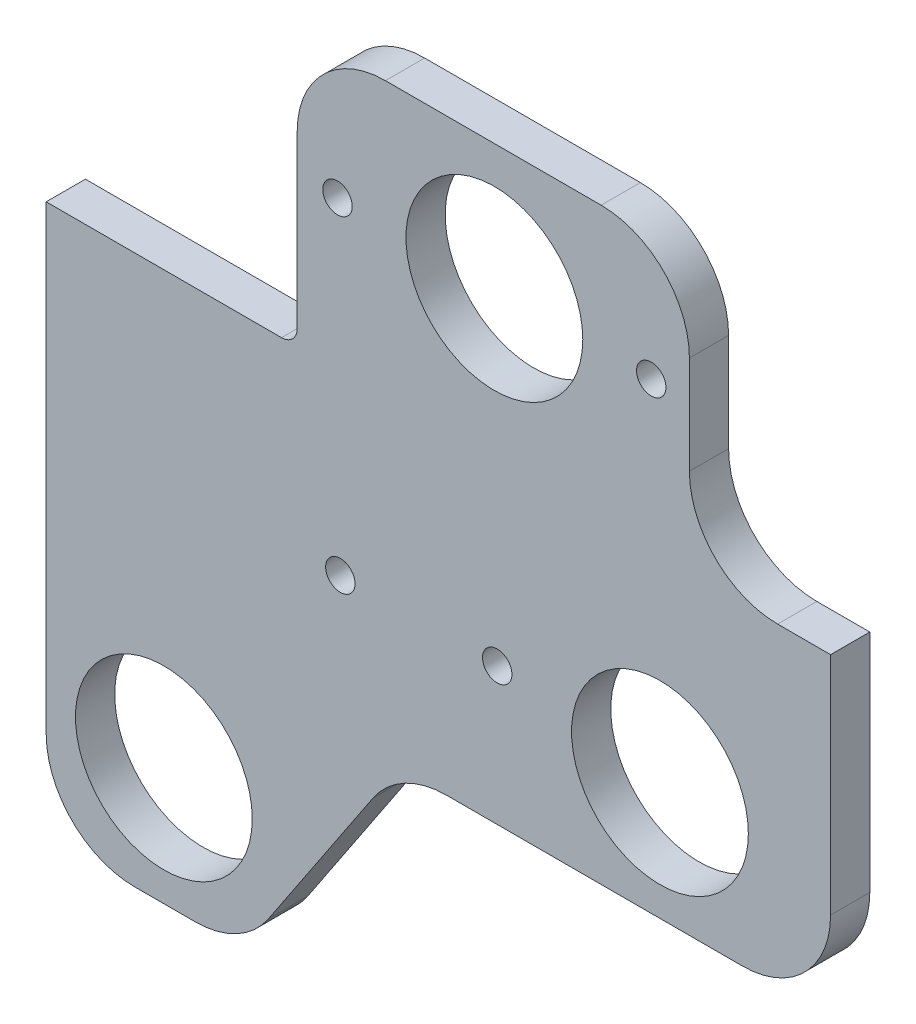
ISO-10303-21;
HEADER;
FILE_DESCRIPTION(('STEP AP214'),'2;1');
FILE_NAME('part.step','',(''),(''),'','','');
FILE_SCHEMA(('AUTOMOTIVE_DESIGN { 1 0 10303 214 1 1 1 1 }'));
ENDSEC;
DATA;
#1=APPLICATION_CONTEXT('core data for automotive mechanical design processes');
#2=APPLICATION_PROTOCOL_DEFINITION('international standard','automotive_design',2000,#1);
#3=PRODUCT_CONTEXT('',#1,'mechanical');
#4=PRODUCT('Part','Part','',(#3));
#5=PRODUCT_RELATED_PRODUCT_CATEGORY('part','',(#4));
#6=PRODUCT_DEFINITION_FORMATION('','',#4);
#7=PRODUCT_DEFINITION_CONTEXT('part definition',#1,'design');
#8=PRODUCT_DEFINITION('design','',#6,#7);
#9=PRODUCT_DEFINITION_SHAPE('','',#8);
#10=(LENGTH_UNIT() NAMED_UNIT(*) SI_UNIT(.MILLI.,.METRE.));
#11=(NAMED_UNIT(*) PLANE_ANGLE_UNIT() SI_UNIT($,.RADIAN.));
#12=(NAMED_UNIT(*) SI_UNIT($,.STERADIAN.) SOLID_ANGLE_UNIT());
#13=UNCERTAINTY_MEASURE_WITH_UNIT(LENGTH_MEASURE(1.E-05),#10,'distance_accuracy_value','');
#14=(GEOMETRIC_REPRESENTATION_CONTEXT(3) GLOBAL_UNCERTAINTY_ASSIGNED_CONTEXT((#13)) GLOBAL_UNIT_ASSIGNED_CONTEXT((#10,
#11,#12)) REPRESENTATION_CONTEXT('',''));
#15=CARTESIAN_POINT('',(0.,0.,0.));
#16=DIRECTION('',(0.,0.,1.));
#17=DIRECTION('',(1.,0.,0.));
#18=AXIS2_PLACEMENT_3D('',#15,#16,#17);
#19=CARTESIAN_POINT('',(0.,44.45,6.35));
#20=DIRECTION('',(0.,1.,0.));
#21=DIRECTION('',(0.,0.,1.));
#22=AXIS2_PLACEMENT_3D('',#19,#20,#21);
#23=PLANE('',#22);
#24=DIRECTION('',(1.,0.,0.));
#25=VECTOR('',#24,1.);
#26=CARTESIAN_POINT('',(0.,44.45,0.));
#27=LINE('',#26,#25);
#28=CARTESIAN_POINT('',(54.9275,44.45,0.));
#29=VERTEX_POINT('',#28);
#30=CARTESIAN_POINT('',(63.5,44.45,0.));
#31=VERTEX_POINT('',#30);
#32=EDGE_CURVE('E218',#29,#31,#27,.T.);
#33=ORIENTED_EDGE('',*,*,#32,.F.);
#34=DIRECTION('',(0.,0.,1.));
#35=VECTOR('',#34,1.);
#36=CARTESIAN_POINT('',(54.9275,44.45,6.35));
#37=LINE('',#36,#35);
#38=CARTESIAN_POINT('',(54.9275,44.45,6.35));
#39=VERTEX_POINT('',#38);
#40=EDGE_CURVE('E171',#29,#39,#37,.T.);
#41=ORIENTED_EDGE('',*,*,#40,.T.);
#42=DIRECTION('',(1.,0.,0.));
#43=VECTOR('',#42,1.);
#44=CARTESIAN_POINT('',(0.,44.45,6.35));
#45=LINE('',#44,#43);
#46=CARTESIAN_POINT('',(63.5,44.45,6.35));
#47=VERTEX_POINT('',#46);
#48=EDGE_CURVE('E165',#39,#47,#45,.T.);
#49=ORIENTED_EDGE('',*,*,#48,.T.);
#50=DIRECTION('',(0.,0.,-1.));
#51=VECTOR('',#50,1.);
#52=CARTESIAN_POINT('',(63.5,44.45,6.35));
#53=LINE('',#52,#51);
#54=EDGE_CURVE('E168',#47,#31,#53,.T.);
#55=ORIENTED_EDGE('',*,*,#54,.T.);
#56=EDGE_LOOP('',(#33,#41,#49,#55));
#57=FACE_BOUND('',#56,.T.);
#58=ADVANCED_FACE('F39',(#57),#23,.T.);
#59=CARTESIAN_POINT('',(-1.46538461538461,0.976923076923073,6.35));
#60=DIRECTION('',(0.832050294337844,-0.554700196225228,0.));
#61=DIRECTION('',(0.554700196225228,0.832050294337844,0.));
#62=AXIS2_PLACEMENT_3D('',#59,#60,#61);
#63=PLANE('',#62);
#64=DIRECTION('',(-0.554700196225228,-0.832050294337844,0.));
#65=VECTOR('',#64,1.);
#66=CARTESIAN_POINT('',(-1.46538461538461,0.976923076923073,0.));
#67=LINE('',#66,#65);
#68=CARTESIAN_POINT('',(-10.5914806309547,-12.712220946432,0.));
#69=VERTEX_POINT('',#68);
#70=CARTESIAN_POINT('',(-27.5085193690452,-38.0877790535679,0.));
#71=VERTEX_POINT('',#70);
#72=EDGE_CURVE('E211',#69,#71,#67,.T.);
#73=ORIENTED_EDGE('',*,*,#72,.F.);
#74=DIRECTION('',(0.,0.,-1.));
#75=VECTOR('',#74,1.);
#76=CARTESIAN_POINT('',(-10.5914806309547,-12.712220946432,6.35));
#77=LINE('',#76,#75);
#78=CARTESIAN_POINT('',(-10.5914806309547,-12.712220946432,6.35));
#79=VERTEX_POINT('',#78);
#80=EDGE_CURVE('E249',#69,#79,#77,.F.);
#81=ORIENTED_EDGE('',*,*,#80,.T.);
#82=DIRECTION('',(-0.554700196225228,-0.832050294337844,0.));
#83=VECTOR('',#82,1.);
#84=CARTESIAN_POINT('',(-1.46538461538461,0.976923076923073,6.35));
#85=LINE('',#84,#83);
#86=CARTESIAN_POINT('',(-27.5085193690452,-38.0877790535679,6.35));
#87=VERTEX_POINT('',#86);
#88=EDGE_CURVE('E194',#79,#87,#85,.T.);
#89=ORIENTED_EDGE('',*,*,#88,.T.);
#90=DIRECTION('',(0.,0.,-1.));
#91=VECTOR('',#90,1.);
#92=CARTESIAN_POINT('',(-27.5085193690453,-38.0877790535679,0.));
#93=LINE('',#92,#91);
#94=EDGE_CURVE('E246',#87,#71,#93,.T.);
#95=ORIENTED_EDGE('',*,*,#94,.T.);
#96=EDGE_LOOP('',(#73,#81,#89,#95));
#97=FACE_BOUND('',#96,.T.);
#98=ADVANCED_FACE('F323',(#97),#63,.T.);
#99=CARTESIAN_POINT('',(0.,-6.34999999999999,6.35));
#100=DIRECTION('',(0.,-1.,0.));
#101=DIRECTION('',(1.,0.,0.));
#102=AXIS2_PLACEMENT_3D('',#99,#100,#101);
#103=PLANE('',#102);
#104=DIRECTION('',(-1.,0.,0.));
#105=VECTOR('',#104,1.);
#106=CARTESIAN_POINT('',(0.,-6.34999999999999,0.));
#107=LINE('',#106,#105);
#108=CARTESIAN_POINT('',(49.2125,-6.34999999999999,0.));
#109=VERTEX_POINT('',#108);
#110=CARTESIAN_POINT('',(1.29643794939727,-6.34999999999999,0.));
#111=VERTEX_POINT('',#110);
#112=EDGE_CURVE('E214',#109,#111,#107,.T.);
#113=ORIENTED_EDGE('',*,*,#112,.F.);
#114=DIRECTION('',(0.,0.,-1.));
#115=VECTOR('',#114,1.);
#116=CARTESIAN_POINT('',(49.2125,-6.34999999999999,6.35));
#117=LINE('',#116,#115);
#118=CARTESIAN_POINT('',(49.2125,-6.34999999999999,6.35));
#119=VERTEX_POINT('',#118);
#120=EDGE_CURVE('E239',#109,#119,#117,.F.);
#121=ORIENTED_EDGE('',*,*,#120,.T.);
#122=DIRECTION('',(-1.,0.,0.));
#123=VECTOR('',#122,1.);
#124=CARTESIAN_POINT('',(0.,-6.34999999999999,6.35));
#125=LINE('',#124,#123);
#126=CARTESIAN_POINT('',(1.29643794939727,-6.34999999999999,6.35));
#127=VERTEX_POINT('',#126);
#128=EDGE_CURVE('E191',#119,#127,#125,.T.);
#129=ORIENTED_EDGE('',*,*,#128,.T.);
#130=DIRECTION('',(0.,0.,-1.));
#131=VECTOR('',#130,1.);
#132=CARTESIAN_POINT('',(1.29643794939727,-6.34999999999999,0.));
#133=LINE('',#132,#131);
#134=EDGE_CURVE('E236',#127,#111,#133,.T.);
#135=ORIENTED_EDGE('',*,*,#134,.T.);
#136=EDGE_LOOP('',(#113,#121,#129,#135));
#137=FACE_BOUND('',#136,.T.);
#138=ADVANCED_FACE('F359',(#137),#103,.T.);
#139=CARTESIAN_POINT('',(63.5,0.,6.35));
#140=DIRECTION('',(1.,0.,0.));
#141=DIRECTION('',(0.,0.,-1.));
#142=AXIS2_PLACEMENT_3D('',#139,#140,#141);
#143=PLANE('',#142);
#144=DIRECTION('',(0.,-1.,0.));
#145=VECTOR('',#144,1.);
#146=CARTESIAN_POINT('',(63.5,0.,6.35));
#147=LINE('',#146,#145);
#148=CARTESIAN_POINT('',(63.5,7.93750000000001,6.35));
#149=VERTEX_POINT('',#148);
#150=EDGE_CURVE('E174',#47,#149,#147,.T.);
#151=ORIENTED_EDGE('',*,*,#150,.T.);
#152=DIRECTION('',(0.,0.,-1.));
#153=VECTOR('',#152,1.);
#154=CARTESIAN_POINT('',(63.5,7.93750000000001,6.35));
#155=LINE('',#154,#153);
#156=CARTESIAN_POINT('',(63.5,7.93750000000001,0.));
#157=VERTEX_POINT('',#156);
#158=EDGE_CURVE('E183',#149,#157,#155,.T.);
#159=ORIENTED_EDGE('',*,*,#158,.T.);
#160=DIRECTION('',(0.,-1.,0.));
#161=VECTOR('',#160,1.);
#162=CARTESIAN_POINT('',(63.5,0.,0.));
#163=LINE('',#162,#161);
#164=EDGE_CURVE('E182',#31,#157,#163,.T.);
#165=ORIENTED_EDGE('',*,*,#164,.F.);
#166=ORIENTED_EDGE('',*,*,#54,.F.);
#167=EDGE_LOOP('',(#151,#159,#165,#166));
#168=FACE_BOUND('',#167,.T.);
#169=ADVANCED_FACE('F178',(#168),#143,.T.);
#170=CARTESIAN_POINT('',(-63.5,44.45,6.35));
#171=VERTEX_POINT('',#170);
#172=CARTESIAN_POINT('',(-25.4,44.45,6.35));
#173=VERTEX_POINT('',#172);
#174=EDGE_CURVE('E173',#171,#173,#45,.T.);
#175=ORIENTED_EDGE('',*,*,#174,.T.);
#176=DIRECTION('',(0.,0.,1.));
#177=VECTOR('',#176,1.);
#178=CARTESIAN_POINT('',(-25.4,44.45,0.));
#179=LINE('',#178,#177);
#180=CARTESIAN_POINT('',(-25.4,44.45,0.));
#181=VERTEX_POINT('',#180);
#182=EDGE_CURVE('E60',#173,#181,#179,.F.);
#183=ORIENTED_EDGE('',*,*,#182,.T.);
#184=CARTESIAN_POINT('',(-63.5,44.45,0.));
#185=VERTEX_POINT('',#184);
#186=EDGE_CURVE('E219',#185,#181,#27,.T.);
#187=ORIENTED_EDGE('',*,*,#186,.F.);
#188=DIRECTION('',(0.,0.,-1.));
#189=VECTOR('',#188,1.);
#190=CARTESIAN_POINT('',(-63.5,44.45,6.35));
#191=LINE('',#190,#189);
#192=EDGE_CURVE('E184',#171,#185,#191,.T.);
#193=ORIENTED_EDGE('',*,*,#192,.F.);
#194=EDGE_LOOP('',(#175,#183,#187,#193));
#195=FACE_BOUND('',#194,.T.);
#196=ADVANCED_FACE('F345',(#195),#23,.T.);
#197=CARTESIAN_POINT('',(-63.5,0.,6.35));
#198=DIRECTION('',(1.,0.,0.));
#199=DIRECTION('',(0.,1.,0.));
#200=AXIS2_PLACEMENT_3D('',#197,#198,#199);
#201=PLANE('',#200);
#202=DIRECTION('',(0.,-1.,0.));
#203=VECTOR('',#202,1.);
#204=CARTESIAN_POINT('',(-63.5,0.,0.));
#205=LINE('',#204,#203);
#206=CARTESIAN_POINT('',(-63.4999999999999,-30.1625,0.));
#207=VERTEX_POINT('',#206);
#208=EDGE_CURVE('E221',#185,#207,#205,.T.);
#209=ORIENTED_EDGE('',*,*,#208,.T.);
#210=DIRECTION('',(0.,0.,-1.));
#211=VECTOR('',#210,1.);
#212=CARTESIAN_POINT('',(-63.4999999999999,-30.1625,6.35));
#213=LINE('',#212,#211);
#214=CARTESIAN_POINT('',(-63.4999999999999,-30.1625,6.35));
#215=VERTEX_POINT('',#214);
#216=EDGE_CURVE('E256',#207,#215,#213,.F.);
#217=ORIENTED_EDGE('',*,*,#216,.T.);
#218=DIRECTION('',(0.,-1.,0.));
#219=VECTOR('',#218,1.);
#220=CARTESIAN_POINT('',(-63.5,0.,6.35));
#221=LINE('',#220,#219);
#222=EDGE_CURVE('E198',#171,#215,#221,.T.);
#223=ORIENTED_EDGE('',*,*,#222,.F.);
#224=ORIENTED_EDGE('',*,*,#192,.T.);
#225=EDGE_LOOP('',(#209,#217,#223,#224));
#226=FACE_BOUND('',#225,.T.);
#227=ADVANCED_FACE('F343',(#226),#201,.F.);
#228=CARTESIAN_POINT('',(-44.45,-25.4,6.35));
#229=DIRECTION('',(0.,0.,-1.));
#230=DIRECTION('',(-1.,0.,0.));
#231=AXIS2_PLACEMENT_3D('',#228,#229,#230);
#232=CYLINDRICAL_SURFACE('',#231,14.3129);
#233=CARTESIAN_POINT('',(-44.45,-25.4,6.35));
#234=DIRECTION('',(0.,0.,1.));
#235=DIRECTION('',(1.,0.,0.));
#236=AXIS2_PLACEMENT_3D('',#233,#234,#235);
#237=CIRCLE('',#236,14.3129);
#238=CARTESIAN_POINT('',(-30.1371,-25.4,6.35));
#239=VERTEX_POINT('',#238);
#240=EDGE_CURVE('E316',#239,#239,#237,.T.);
#241=ORIENTED_EDGE('',*,*,#240,.T.);
#242=EDGE_LOOP('',(#241));
#243=FACE_BOUND('',#242,.T.);
#244=CARTESIAN_POINT('',(-44.45,-25.4,0.));
#245=DIRECTION('',(0.,0.,1.));
#246=DIRECTION('',(1.,0.,0.));
#247=AXIS2_PLACEMENT_3D('',#244,#245,#246);
#248=CIRCLE('',#247,14.3129);
#249=CARTESIAN_POINT('',(-30.1371,-25.4,0.));
#250=VERTEX_POINT('',#249);
#251=EDGE_CURVE('E207',#250,#250,#248,.T.);
#252=ORIENTED_EDGE('',*,*,#251,.F.);
#253=EDGE_LOOP('',(#252));
#254=FACE_BOUND('',#253,.T.);
#255=ADVANCED_FACE('F368',(#243,#254),#232,.F.);
#256=CARTESIAN_POINT('',(35.8718525682768,12.7,6.35));
#257=DIRECTION('',(0.,0.,-1.));
#258=DIRECTION('',(-1.,0.,0.));
#259=AXIS2_PLACEMENT_3D('',#256,#257,#258);
#260=CYLINDRICAL_SURFACE('',#259,14.3129);
#261=CARTESIAN_POINT('',(35.8718525682768,12.7,6.35));
#262=DIRECTION('',(0.,0.,1.));
#263=DIRECTION('',(1.,0.,0.));
#264=AXIS2_PLACEMENT_3D('',#261,#262,#263);
#265=CIRCLE('',#264,14.3129);
#266=CARTESIAN_POINT('',(50.1847525682768,12.7,6.35));
#267=VERTEX_POINT('',#266);
#268=EDGE_CURVE('E227',#267,#267,#265,.T.);
#269=ORIENTED_EDGE('',*,*,#268,.T.);
#270=EDGE_LOOP('',(#269));
#271=FACE_BOUND('',#270,.T.);
#272=CARTESIAN_POINT('',(35.8718525682768,12.7,0.));
#273=DIRECTION('',(0.,0.,1.));
#274=DIRECTION('',(1.,0.,0.));
#275=AXIS2_PLACEMENT_3D('',#272,#273,#274);
#276=CIRCLE('',#275,14.3129);
#277=CARTESIAN_POINT('',(50.1847525682768,12.7,0.));
#278=VERTEX_POINT('',#277);
#279=EDGE_CURVE('E204',#278,#278,#276,.T.);
#280=ORIENTED_EDGE('',*,*,#279,.F.);
#281=EDGE_LOOP('',(#280));
#282=FACE_BOUND('',#281,.T.);
#283=ADVANCED_FACE('F377',(#271,#282),#260,.F.);
#284=CARTESIAN_POINT('',(0.,-44.45,6.35));
#285=DIRECTION('',(0.,1.,0.));
#286=DIRECTION('',(0.,0.,1.));
#287=AXIS2_PLACEMENT_3D('',#284,#285,#286);
#288=PLANE('',#287);
#289=DIRECTION('',(1.,0.,0.));
#290=VECTOR('',#289,1.);
#291=CARTESIAN_POINT('',(0.,-44.45,0.));
#292=LINE('',#291,#290);
#293=CARTESIAN_POINT('',(-49.2124999999999,-44.45,0.));
#294=VERTEX_POINT('',#293);
#295=CARTESIAN_POINT('',(-39.3964379493972,-44.45,0.));
#296=VERTEX_POINT('',#295);
#297=EDGE_CURVE('E224',#294,#296,#292,.T.);
#298=ORIENTED_EDGE('',*,*,#297,.T.);
#299=DIRECTION('',(0.,0.,-1.));
#300=VECTOR('',#299,1.);
#301=CARTESIAN_POINT('',(-39.3964379493972,-44.45,6.35));
#302=LINE('',#301,#300);
#303=CARTESIAN_POINT('',(-39.3964379493972,-44.45,6.35));
#304=VERTEX_POINT('',#303);
#305=EDGE_CURVE('E254',#296,#304,#302,.F.);
#306=ORIENTED_EDGE('',*,*,#305,.T.);
#307=DIRECTION('',(1.,0.,0.));
#308=VECTOR('',#307,1.);
#309=CARTESIAN_POINT('',(0.,-44.45,6.35));
#310=LINE('',#309,#308);
#311=CARTESIAN_POINT('',(-49.2124999999999,-44.45,6.35));
#312=VERTEX_POINT('',#311);
#313=EDGE_CURVE('E201',#312,#304,#310,.T.);
#314=ORIENTED_EDGE('',*,*,#313,.F.);
#315=DIRECTION('',(0.,0.,-1.));
#316=VECTOR('',#315,1.);
#317=CARTESIAN_POINT('',(-49.2124999999999,-44.45,6.35));
#318=LINE('',#317,#316);
#319=EDGE_CURVE('E251',#312,#294,#318,.T.);
#320=ORIENTED_EDGE('',*,*,#319,.T.);
#321=EDGE_LOOP('',(#298,#306,#314,#320));
#322=FACE_BOUND('',#321,.T.);
#323=ADVANCED_FACE('F334',(#322),#288,.F.);
#324=CARTESIAN_POINT('',(0.,0.,6.35));
#325=DIRECTION('',(0.,0.,1.));
#326=DIRECTION('',(1.,0.,0.));
#327=AXIS2_PLACEMENT_3D('',#324,#325,#326);
#328=PLANE('',#327);
#329=CARTESIAN_POINT('',(-15.875,15.875,6.35));
#330=DIRECTION('',(0.,0.,1.));
#331=DIRECTION('',(1.,0.,0.));
#332=AXIS2_PLACEMENT_3D('',#329,#330,#331);
#333=CIRCLE('',#332,2.38125);
#334=CARTESIAN_POINT('',(-13.49375,15.875,6.35));
#335=VERTEX_POINT('',#334);
#336=EDGE_CURVE('E445',#335,#335,#333,.T.);
#337=ORIENTED_EDGE('',*,*,#336,.F.);
#338=EDGE_LOOP('',(#337));
#339=FACE_BOUND('',#338,.T.);
#340=CARTESIAN_POINT('',(9.525,15.875,6.35));
#341=DIRECTION('',(0.,0.,1.));
#342=DIRECTION('',(1.,0.,0.));
#343=AXIS2_PLACEMENT_3D('',#340,#341,#342);
#344=CIRCLE('',#343,2.38125);
#345=CARTESIAN_POINT('',(11.90625,15.875,6.35));
#346=VERTEX_POINT('',#345);
#347=EDGE_CURVE('E442',#346,#346,#344,.T.);
#348=ORIENTED_EDGE('',*,*,#347,.F.);
#349=EDGE_LOOP('',(#348));
#350=FACE_BOUND('',#349,.T.);
#351=CARTESIAN_POINT('',(-16.3370323632221,68.577618638679,6.35));
#352=DIRECTION('',(0.,0.,1.));
#353=DIRECTION('',(1.,0.,0.));
#354=AXIS2_PLACEMENT_3D('',#351,#352,#353);
#355=CIRCLE('',#354,2.38125);
#356=CARTESIAN_POINT('',(-13.9557823632221,68.577618638679,6.35));
#357=VERTEX_POINT('',#356);
#358=EDGE_CURVE('E434',#357,#357,#355,.T.);
#359=ORIENTED_EDGE('',*,*,#358,.F.);
#360=EDGE_LOOP('',(#359));
#361=FACE_BOUND('',#360,.T.);
#362=CARTESIAN_POINT('',(34.4629676367779,68.577618638679,6.35));
#363=DIRECTION('',(0.,0.,1.));
#364=DIRECTION('',(1.,0.,0.));
#365=AXIS2_PLACEMENT_3D('',#362,#363,#364);
#366=CIRCLE('',#365,2.38125);
#367=CARTESIAN_POINT('',(36.8442176367779,68.577618638679,6.35));
#368=VERTEX_POINT('',#367);
#369=EDGE_CURVE('E430',#368,#368,#366,.T.);
#370=ORIENTED_EDGE('',*,*,#369,.F.);
#371=EDGE_LOOP('',(#370));
#372=FACE_BOUND('',#371,.T.);
#373=CARTESIAN_POINT('',(9.06296763677788,68.577618638679,6.35));
#374=DIRECTION('',(0.,0.,1.));
#375=DIRECTION('',(1.,0.,0.));
#376=AXIS2_PLACEMENT_3D('',#373,#374,#375);
#377=CIRCLE('',#376,14.3129);
#378=CARTESIAN_POINT('',(23.3758676367779,68.577618638679,6.35));
#379=VERTEX_POINT('',#378);
#380=EDGE_CURVE('E308',#379,#379,#377,.T.);
#381=ORIENTED_EDGE('',*,*,#380,.F.);
#382=EDGE_LOOP('',(#381));
#383=FACE_BOUND('',#382,.T.);
#384=ORIENTED_EDGE('',*,*,#268,.F.);
#385=EDGE_LOOP('',(#384));
#386=FACE_BOUND('',#385,.T.);
#387=ORIENTED_EDGE('',*,*,#240,.F.);
#388=EDGE_LOOP('',(#387));
#389=FACE_BOUND('',#388,.T.);
#390=DIRECTION('',(-1.,0.,0.));
#391=VECTOR('',#390,1.);
#392=CARTESIAN_POINT('',(-22.86,88.9,6.35));
#393=LINE('',#392,#391);
#394=CARTESIAN_POINT('',(26.3525,88.9,6.35));
#395=VERTEX_POINT('',#394);
#396=CARTESIAN_POINT('',(-8.57249999999997,88.9,6.35));
#397=VERTEX_POINT('',#396);
#398=EDGE_CURVE('E305',#395,#397,#393,.T.);
#399=ORIENTED_EDGE('',*,*,#398,.T.);
#400=CARTESIAN_POINT('',(-8.57249999999997,74.6125,6.35));
#401=DIRECTION('',(0.,0.,1.));
#402=DIRECTION('',(1.,0.,0.));
#403=AXIS2_PLACEMENT_3D('',#400,#401,#402);
#404=CIRCLE('',#403,14.2875);
#405=CARTESIAN_POINT('',(-22.86,74.6125,6.35));
#406=VERTEX_POINT('',#405);
#407=EDGE_CURVE('E269',#397,#406,#404,.T.);
#408=ORIENTED_EDGE('',*,*,#407,.T.);
#409=DIRECTION('',(0.,-1.,0.));
#410=VECTOR('',#409,1.);
#411=CARTESIAN_POINT('',(-22.86,44.45,6.35));
#412=LINE('',#411,#410);
#413=CARTESIAN_POINT('',(-22.86,46.99,6.35));
#414=VERTEX_POINT('',#413);
#415=EDGE_CURVE('E295',#406,#414,#412,.T.);
#416=ORIENTED_EDGE('',*,*,#415,.T.);
#417=CARTESIAN_POINT('',(-25.4,46.99,6.35));
#418=DIRECTION('',(0.,0.,1.));
#419=DIRECTION('',(1.,0.,0.));
#420=AXIS2_PLACEMENT_3D('',#417,#418,#419);
#421=CIRCLE('',#420,2.54);
#422=EDGE_CURVE('E47',#414,#173,#421,.F.);
#423=ORIENTED_EDGE('',*,*,#422,.T.);
#424=ORIENTED_EDGE('',*,*,#174,.F.);
#425=ORIENTED_EDGE('',*,*,#222,.T.);
#426=CARTESIAN_POINT('',(-49.2124999999999,-30.1625,6.35));
#427=DIRECTION('',(0.,0.,1.));
#428=DIRECTION('',(1.,0.,0.));
#429=AXIS2_PLACEMENT_3D('',#426,#427,#428);
#430=CIRCLE('',#429,14.2875);
#431=EDGE_CURVE('E241',#215,#312,#430,.T.);
#432=ORIENTED_EDGE('',*,*,#431,.T.);
#433=ORIENTED_EDGE('',*,*,#313,.T.);
#434=CARTESIAN_POINT('',(-39.3964379493972,-30.1625,6.35));
#435=DIRECTION('',(0.,0.,1.));
#436=DIRECTION('',(1.,0.,0.));
#437=AXIS2_PLACEMENT_3D('',#434,#435,#436);
#438=CIRCLE('',#437,14.2875);
#439=EDGE_CURVE('E243',#304,#87,#438,.T.);
#440=ORIENTED_EDGE('',*,*,#439,.T.);
#441=ORIENTED_EDGE('',*,*,#88,.F.);
#442=CARTESIAN_POINT('',(1.29643794939727,-20.6375,6.35));
#443=DIRECTION('',(0.,0.,1.));
#444=DIRECTION('',(1.,0.,0.));
#445=AXIS2_PLACEMENT_3D('',#442,#443,#444);
#446=CIRCLE('',#445,14.2875);
#447=EDGE_CURVE('E260',#79,#127,#446,.F.);
#448=ORIENTED_EDGE('',*,*,#447,.T.);
#449=ORIENTED_EDGE('',*,*,#128,.F.);
#450=CARTESIAN_POINT('',(49.2125,7.93750000000001,6.35));
#451=DIRECTION('',(0.,0.,1.));
#452=DIRECTION('',(1.,0.,0.));
#453=AXIS2_PLACEMENT_3D('',#450,#451,#452);
#454=CIRCLE('',#453,14.2875);
#455=EDGE_CURVE('E190',#119,#149,#454,.T.);
#456=ORIENTED_EDGE('',*,*,#455,.T.);
#457=ORIENTED_EDGE('',*,*,#150,.F.);
#458=ORIENTED_EDGE('',*,*,#48,.F.);
#459=CARTESIAN_POINT('',(54.9275,58.7375,6.35));
#460=DIRECTION('',(0.,0.,1.));
#461=DIRECTION('',(1.,0.,0.));
#462=AXIS2_PLACEMENT_3D('',#459,#460,#461);
#463=CIRCLE('',#462,14.2875);
#464=CARTESIAN_POINT('',(40.64,58.7375,6.35));
#465=VERTEX_POINT('',#464);
#466=EDGE_CURVE('E283',#39,#465,#463,.F.);
#467=ORIENTED_EDGE('',*,*,#466,.T.);
#468=DIRECTION('',(0.,1.,0.));
#469=VECTOR('',#468,1.);
#470=CARTESIAN_POINT('',(40.64,44.45,6.35));
#471=LINE('',#470,#469);
#472=CARTESIAN_POINT('',(40.64,74.6125,6.35));
#473=VERTEX_POINT('',#472);
#474=EDGE_CURVE('E301',#465,#473,#471,.T.);
#475=ORIENTED_EDGE('',*,*,#474,.T.);
#476=CARTESIAN_POINT('',(26.3525,74.6125,6.35));
#477=DIRECTION('',(0.,0.,1.));
#478=DIRECTION('',(1.,0.,0.));
#479=AXIS2_PLACEMENT_3D('',#476,#477,#478);
#480=CIRCLE('',#479,14.2875);
#481=EDGE_CURVE('E267',#473,#395,#480,.T.);
#482=ORIENTED_EDGE('',*,*,#481,.T.);
#483=EDGE_LOOP('',(#399,#408,#416,#423,#424,#425,#432,#433,#440,#441,#448,#449,#456,#457,#458,
#467,#475,#482));
#484=FACE_BOUND('',#483,.T.);
#485=ADVANCED_FACE('F187',(#339,#350,#361,#372,#383,#386,#389,#484),#328,.T.);
#486=CARTESIAN_POINT('',(0.,0.,0.));
#487=DIRECTION('',(0.,0.,1.));
#488=DIRECTION('',(1.,0.,0.));
#489=AXIS2_PLACEMENT_3D('',#486,#487,#488);
#490=PLANE('',#489);
#491=CARTESIAN_POINT('',(-15.875,15.875,0.));
#492=DIRECTION('',(0.,0.,1.));
#493=DIRECTION('',(1.,0.,0.));
#494=AXIS2_PLACEMENT_3D('',#491,#492,#493);
#495=CIRCLE('',#494,2.38125);
#496=CARTESIAN_POINT('',(-13.49375,15.875,0.));
#497=VERTEX_POINT('',#496);
#498=EDGE_CURVE('E431',#497,#497,#495,.T.);
#499=ORIENTED_EDGE('',*,*,#498,.T.);
#500=EDGE_LOOP('',(#499));
#501=FACE_BOUND('',#500,.T.);
#502=CARTESIAN_POINT('',(9.525,15.875,0.));
#503=DIRECTION('',(0.,0.,1.));
#504=DIRECTION('',(1.,0.,0.));
#505=AXIS2_PLACEMENT_3D('',#502,#503,#504);
#506=CIRCLE('',#505,2.38125);
#507=CARTESIAN_POINT('',(11.90625,15.875,0.));
#508=VERTEX_POINT('',#507);
#509=EDGE_CURVE('E439',#508,#508,#506,.T.);
#510=ORIENTED_EDGE('',*,*,#509,.T.);
#511=EDGE_LOOP('',(#510));
#512=FACE_BOUND('',#511,.T.);
#513=CARTESIAN_POINT('',(-16.3370323632221,68.577618638679,0.));
#514=DIRECTION('',(0.,0.,1.));
#515=DIRECTION('',(1.,0.,0.));
#516=AXIS2_PLACEMENT_3D('',#513,#514,#515);
#517=CIRCLE('',#516,2.38125);
#518=CARTESIAN_POINT('',(-13.9557823632221,68.577618638679,0.));
#519=VERTEX_POINT('',#518);
#520=EDGE_CURVE('E425',#519,#519,#517,.T.);
#521=ORIENTED_EDGE('',*,*,#520,.T.);
#522=EDGE_LOOP('',(#521));
#523=FACE_BOUND('',#522,.T.);
#524=CARTESIAN_POINT('',(34.4629676367779,68.577618638679,0.));
#525=DIRECTION('',(0.,0.,1.));
#526=DIRECTION('',(1.,0.,0.));
#527=AXIS2_PLACEMENT_3D('',#524,#525,#526);
#528=CIRCLE('',#527,2.38125);
#529=CARTESIAN_POINT('',(36.8442176367779,68.577618638679,0.));
#530=VERTEX_POINT('',#529);
#531=EDGE_CURVE('E427',#530,#530,#528,.T.);
#532=ORIENTED_EDGE('',*,*,#531,.T.);
#533=EDGE_LOOP('',(#532));
#534=FACE_BOUND('',#533,.T.);
#535=CARTESIAN_POINT('',(9.06296763677788,68.577618638679,0.));
#536=DIRECTION('',(0.,0.,1.));
#537=DIRECTION('',(1.,0.,0.));
#538=AXIS2_PLACEMENT_3D('',#535,#536,#537);
#539=CIRCLE('',#538,14.3129);
#540=CARTESIAN_POINT('',(23.3758676367779,68.577618638679,0.));
#541=VERTEX_POINT('',#540);
#542=EDGE_CURVE('E302',#541,#541,#539,.T.);
#543=ORIENTED_EDGE('',*,*,#542,.T.);
#544=EDGE_LOOP('',(#543));
#545=FACE_BOUND('',#544,.T.);
#546=ORIENTED_EDGE('',*,*,#279,.T.);
#547=EDGE_LOOP('',(#546));
#548=FACE_BOUND('',#547,.T.);
#549=ORIENTED_EDGE('',*,*,#251,.T.);
#550=EDGE_LOOP('',(#549));
#551=FACE_BOUND('',#550,.T.);
#552=DIRECTION('',(0.,-1.,0.));
#553=VECTOR('',#552,1.);
#554=CARTESIAN_POINT('',(-22.86,44.45,0.));
#555=LINE('',#554,#553);
#556=CARTESIAN_POINT('',(-22.86,74.6125,0.));
#557=VERTEX_POINT('',#556);
#558=CARTESIAN_POINT('',(-22.86,46.99,0.));
#559=VERTEX_POINT('',#558);
#560=EDGE_CURVE('E298',#557,#559,#555,.T.);
#561=ORIENTED_EDGE('',*,*,#560,.F.);
#562=CARTESIAN_POINT('',(-8.57249999999997,74.6125,0.));
#563=DIRECTION('',(0.,0.,1.));
#564=DIRECTION('',(1.,0.,0.));
#565=AXIS2_PLACEMENT_3D('',#562,#563,#564);
#566=CIRCLE('',#565,14.2875);
#567=CARTESIAN_POINT('',(-8.57249999999997,88.9,0.));
#568=VERTEX_POINT('',#567);
#569=EDGE_CURVE('E275',#557,#568,#566,.F.);
#570=ORIENTED_EDGE('',*,*,#569,.T.);
#571=DIRECTION('',(-1.,0.,0.));
#572=VECTOR('',#571,1.);
#573=CARTESIAN_POINT('',(-22.86,88.9,0.));
#574=LINE('',#573,#572);
#575=CARTESIAN_POINT('',(26.3525,88.9,0.));
#576=VERTEX_POINT('',#575);
#577=EDGE_CURVE('E208',#576,#568,#574,.T.);
#578=ORIENTED_EDGE('',*,*,#577,.F.);
#579=CARTESIAN_POINT('',(26.3525,74.6125,0.));
#580=DIRECTION('',(0.,0.,1.));
#581=DIRECTION('',(1.,0.,0.));
#582=AXIS2_PLACEMENT_3D('',#579,#580,#581);
#583=CIRCLE('',#582,14.2875);
#584=CARTESIAN_POINT('',(40.64,74.6125,0.));
#585=VERTEX_POINT('',#584);
#586=EDGE_CURVE('E273',#576,#585,#583,.F.);
#587=ORIENTED_EDGE('',*,*,#586,.T.);
#588=DIRECTION('',(0.,1.,0.));
#589=VECTOR('',#588,1.);
#590=CARTESIAN_POINT('',(40.64,44.45,0.));
#591=LINE('',#590,#589);
#592=CARTESIAN_POINT('',(40.64,58.7375,0.));
#593=VERTEX_POINT('',#592);
#594=EDGE_CURVE('E416',#593,#585,#591,.T.);
#595=ORIENTED_EDGE('',*,*,#594,.F.);
#596=CARTESIAN_POINT('',(54.9275,58.7375,0.));
#597=DIRECTION('',(0.,0.,1.));
#598=DIRECTION('',(1.,0.,0.));
#599=AXIS2_PLACEMENT_3D('',#596,#597,#598);
#600=CIRCLE('',#599,14.2875);
#601=EDGE_CURVE('E285',#593,#29,#600,.T.);
#602=ORIENTED_EDGE('',*,*,#601,.T.);
#603=ORIENTED_EDGE('',*,*,#32,.T.);
#604=ORIENTED_EDGE('',*,*,#164,.T.);
#605=CARTESIAN_POINT('',(49.2125,7.93750000000001,0.));
#606=DIRECTION('',(0.,0.,1.));
#607=DIRECTION('',(1.,0.,0.));
#608=AXIS2_PLACEMENT_3D('',#605,#606,#607);
#609=CIRCLE('',#608,14.2875);
#610=EDGE_CURVE('E234',#157,#109,#609,.F.);
#611=ORIENTED_EDGE('',*,*,#610,.T.);
#612=ORIENTED_EDGE('',*,*,#112,.T.);
#613=CARTESIAN_POINT('',(1.29643794939727,-20.6375,0.));
#614=DIRECTION('',(0.,0.,1.));
#615=DIRECTION('',(1.,0.,0.));
#616=AXIS2_PLACEMENT_3D('',#613,#614,#615);
#617=CIRCLE('',#616,14.2875);
#618=EDGE_CURVE('E258',#111,#69,#617,.T.);
#619=ORIENTED_EDGE('',*,*,#618,.T.);
#620=ORIENTED_EDGE('',*,*,#72,.T.);
#621=CARTESIAN_POINT('',(-39.3964379493972,-30.1625,0.));
#622=DIRECTION('',(0.,0.,1.));
#623=DIRECTION('',(1.,0.,0.));
#624=AXIS2_PLACEMENT_3D('',#621,#622,#623);
#625=CIRCLE('',#624,14.2875);
#626=EDGE_CURVE('E232',#71,#296,#625,.F.);
#627=ORIENTED_EDGE('',*,*,#626,.T.);
#628=ORIENTED_EDGE('',*,*,#297,.F.);
#629=CARTESIAN_POINT('',(-49.2124999999999,-30.1625,0.));
#630=DIRECTION('',(0.,0.,1.));
#631=DIRECTION('',(1.,0.,0.));
#632=AXIS2_PLACEMENT_3D('',#629,#630,#631);
#633=CIRCLE('',#632,14.2875);
#634=EDGE_CURVE('E230',#294,#207,#633,.F.);
#635=ORIENTED_EDGE('',*,*,#634,.T.);
#636=ORIENTED_EDGE('',*,*,#208,.F.);
#637=ORIENTED_EDGE('',*,*,#186,.T.);
#638=CARTESIAN_POINT('',(-25.4,46.99,0.));
#639=DIRECTION('',(0.,0.,1.));
#640=DIRECTION('',(1.,0.,0.));
#641=AXIS2_PLACEMENT_3D('',#638,#639,#640);
#642=CIRCLE('',#641,2.54);
#643=EDGE_CURVE('E11',#181,#559,#642,.T.);
#644=ORIENTED_EDGE('',*,*,#643,.T.);
#645=EDGE_LOOP('',(#561,#570,#578,#587,#595,#602,#603,#604,#611,#612,#619,#620,#627,#628,#635,
#636,#637,#644));
#646=FACE_BOUND('',#645,.T.);
#647=ADVANCED_FACE('F332',(#501,#512,#523,#534,#545,#548,#551,#646),#490,.F.);
#648=CARTESIAN_POINT('',(49.2125,7.93750000000001,6.35));
#649=DIRECTION('',(0.,0.,-1.));
#650=DIRECTION('',(-1.,0.,0.));
#651=AXIS2_PLACEMENT_3D('',#648,#649,#650);
#652=CYLINDRICAL_SURFACE('',#651,14.2875);
#653=ORIENTED_EDGE('',*,*,#455,.F.);
#654=ORIENTED_EDGE('',*,*,#120,.F.);
#655=ORIENTED_EDGE('',*,*,#610,.F.);
#656=ORIENTED_EDGE('',*,*,#158,.F.);
#657=EDGE_LOOP('',(#653,#654,#655,#656));
#658=FACE_BOUND('',#657,.T.);
#659=ADVANCED_FACE('F382',(#658),#652,.T.);
#660=CARTESIAN_POINT('',(1.29643794939727,-20.6375,6.35));
#661=DIRECTION('',(0.,0.,1.));
#662=DIRECTION('',(1.,0.,0.));
#663=AXIS2_PLACEMENT_3D('',#660,#661,#662);
#664=CYLINDRICAL_SURFACE('',#663,14.2875);
#665=ORIENTED_EDGE('',*,*,#447,.F.);
#666=ORIENTED_EDGE('',*,*,#80,.F.);
#667=ORIENTED_EDGE('',*,*,#618,.F.);
#668=ORIENTED_EDGE('',*,*,#134,.F.);
#669=EDGE_LOOP('',(#665,#666,#667,#668));
#670=FACE_BOUND('',#669,.T.);
#671=ADVANCED_FACE('F385',(#670),#664,.F.);
#672=CARTESIAN_POINT('',(-39.3964379493972,-30.1625,6.35));
#673=DIRECTION('',(0.,0.,1.));
#674=DIRECTION('',(1.,0.,0.));
#675=AXIS2_PLACEMENT_3D('',#672,#673,#674);
#676=CYLINDRICAL_SURFACE('',#675,14.2875);
#677=ORIENTED_EDGE('',*,*,#439,.F.);
#678=ORIENTED_EDGE('',*,*,#305,.F.);
#679=ORIENTED_EDGE('',*,*,#626,.F.);
#680=ORIENTED_EDGE('',*,*,#94,.F.);
#681=EDGE_LOOP('',(#677,#678,#679,#680));
#682=FACE_BOUND('',#681,.T.);
#683=ADVANCED_FACE('F328',(#682),#676,.T.);
#684=CARTESIAN_POINT('',(-49.2124999999999,-30.1625,6.35));
#685=DIRECTION('',(0.,0.,-1.));
#686=DIRECTION('',(-1.,0.,0.));
#687=AXIS2_PLACEMENT_3D('',#684,#685,#686);
#688=CYLINDRICAL_SURFACE('',#687,14.2875);
#689=ORIENTED_EDGE('',*,*,#431,.F.);
#690=ORIENTED_EDGE('',*,*,#216,.F.);
#691=ORIENTED_EDGE('',*,*,#634,.F.);
#692=ORIENTED_EDGE('',*,*,#319,.F.);
#693=EDGE_LOOP('',(#689,#690,#691,#692));
#694=FACE_BOUND('',#693,.T.);
#695=ADVANCED_FACE('F339',(#694),#688,.T.);
#696=CARTESIAN_POINT('',(-22.86,44.45,0.));
#697=DIRECTION('',(-1.,0.,0.));
#698=DIRECTION('',(0.,0.,1.));
#699=AXIS2_PLACEMENT_3D('',#696,#697,#698);
#700=PLANE('',#699);
#701=ORIENTED_EDGE('',*,*,#560,.T.);
#702=DIRECTION('',(0.,0.,1.));
#703=VECTOR('',#702,1.);
#704=CARTESIAN_POINT('',(-22.86,46.99,6.35));
#705=LINE('',#704,#703);
#706=EDGE_CURVE('E287',#559,#414,#705,.T.);
#707=ORIENTED_EDGE('',*,*,#706,.T.);
#708=ORIENTED_EDGE('',*,*,#415,.F.);
#709=DIRECTION('',(0.,0.,1.));
#710=VECTOR('',#709,1.);
#711=CARTESIAN_POINT('',(-22.86,74.6125,0.));
#712=LINE('',#711,#710);
#713=EDGE_CURVE('E271',#406,#557,#712,.F.);
#714=ORIENTED_EDGE('',*,*,#713,.T.);
#715=EDGE_LOOP('',(#701,#707,#708,#714));
#716=FACE_BOUND('',#715,.T.);
#717=ADVANCED_FACE('F294',(#716),#700,.T.);
#718=CARTESIAN_POINT('',(-22.86,88.9,0.));
#719=DIRECTION('',(0.,1.,0.));
#720=DIRECTION('',(0.,0.,1.));
#721=AXIS2_PLACEMENT_3D('',#718,#719,#720);
#722=PLANE('',#721);
#723=ORIENTED_EDGE('',*,*,#577,.T.);
#724=DIRECTION('',(0.,0.,1.));
#725=VECTOR('',#724,1.);
#726=CARTESIAN_POINT('',(-8.57249999999997,88.9,0.));
#727=LINE('',#726,#725);
#728=EDGE_CURVE('E264',#568,#397,#727,.T.);
#729=ORIENTED_EDGE('',*,*,#728,.T.);
#730=ORIENTED_EDGE('',*,*,#398,.F.);
#731=DIRECTION('',(0.,0.,1.));
#732=VECTOR('',#731,1.);
#733=CARTESIAN_POINT('',(26.3525,88.9,0.));
#734=LINE('',#733,#732);
#735=EDGE_CURVE('E262',#395,#576,#734,.F.);
#736=ORIENTED_EDGE('',*,*,#735,.T.);
#737=EDGE_LOOP('',(#723,#729,#730,#736));
#738=FACE_BOUND('',#737,.T.);
#739=ADVANCED_FACE('F507',(#738),#722,.T.);
#740=CARTESIAN_POINT('',(40.64,44.45,0.));
#741=DIRECTION('',(1.,0.,0.));
#742=DIRECTION('',(0.,1.,0.));
#743=AXIS2_PLACEMENT_3D('',#740,#741,#742);
#744=PLANE('',#743);
#745=ORIENTED_EDGE('',*,*,#594,.T.);
#746=DIRECTION('',(0.,0.,1.));
#747=VECTOR('',#746,1.);
#748=CARTESIAN_POINT('',(40.64,74.6125,0.));
#749=LINE('',#748,#747);
#750=EDGE_CURVE('E279',#585,#473,#749,.T.);
#751=ORIENTED_EDGE('',*,*,#750,.T.);
#752=ORIENTED_EDGE('',*,*,#474,.F.);
#753=DIRECTION('',(0.,0.,1.));
#754=VECTOR('',#753,1.);
#755=CARTESIAN_POINT('',(40.64,58.7375,0.));
#756=LINE('',#755,#754);
#757=EDGE_CURVE('E277',#465,#593,#756,.F.);
#758=ORIENTED_EDGE('',*,*,#757,.T.);
#759=EDGE_LOOP('',(#745,#751,#752,#758));
#760=FACE_BOUND('',#759,.T.);
#761=ADVANCED_FACE('F398',(#760),#744,.T.);
#762=CARTESIAN_POINT('',(-8.57249999999997,74.6125,0.));
#763=DIRECTION('',(0.,0.,1.));
#764=DIRECTION('',(1.,0.,0.));
#765=AXIS2_PLACEMENT_3D('',#762,#763,#764);
#766=CYLINDRICAL_SURFACE('',#765,14.2875);
#767=ORIENTED_EDGE('',*,*,#569,.F.);
#768=ORIENTED_EDGE('',*,*,#713,.F.);
#769=ORIENTED_EDGE('',*,*,#407,.F.);
#770=ORIENTED_EDGE('',*,*,#728,.F.);
#771=EDGE_LOOP('',(#767,#768,#769,#770));
#772=FACE_BOUND('',#771,.T.);
#773=ADVANCED_FACE('F394',(#772),#766,.T.);
#774=CARTESIAN_POINT('',(26.3525,74.6125,0.));
#775=DIRECTION('',(0.,0.,1.));
#776=DIRECTION('',(1.,0.,0.));
#777=AXIS2_PLACEMENT_3D('',#774,#775,#776);
#778=CYLINDRICAL_SURFACE('',#777,14.2875);
#779=ORIENTED_EDGE('',*,*,#586,.F.);
#780=ORIENTED_EDGE('',*,*,#735,.F.);
#781=ORIENTED_EDGE('',*,*,#481,.F.);
#782=ORIENTED_EDGE('',*,*,#750,.F.);
#783=EDGE_LOOP('',(#779,#780,#781,#782));
#784=FACE_BOUND('',#783,.T.);
#785=ADVANCED_FACE('F397',(#784),#778,.T.);
#786=CARTESIAN_POINT('',(54.9275,58.7375,6.35));
#787=DIRECTION('',(0.,0.,-1.));
#788=DIRECTION('',(-1.,0.,0.));
#789=AXIS2_PLACEMENT_3D('',#786,#787,#788);
#790=CYLINDRICAL_SURFACE('',#789,14.2875);
#791=ORIENTED_EDGE('',*,*,#601,.F.);
#792=ORIENTED_EDGE('',*,*,#757,.F.);
#793=ORIENTED_EDGE('',*,*,#466,.F.);
#794=ORIENTED_EDGE('',*,*,#40,.F.);
#795=EDGE_LOOP('',(#791,#792,#793,#794));
#796=FACE_BOUND('',#795,.T.);
#797=ADVANCED_FACE('F401',(#796),#790,.F.);
#798=CARTESIAN_POINT('',(9.06296763677788,68.577618638679,0.));
#799=DIRECTION('',(0.,0.,1.));
#800=DIRECTION('',(1.,0.,0.));
#801=AXIS2_PLACEMENT_3D('',#798,#799,#800);
#802=CYLINDRICAL_SURFACE('',#801,14.3129);
#803=ORIENTED_EDGE('',*,*,#542,.F.);
#804=EDGE_LOOP('',(#803));
#805=FACE_BOUND('',#804,.T.);
#806=ORIENTED_EDGE('',*,*,#380,.T.);
#807=EDGE_LOOP('',(#806));
#808=FACE_BOUND('',#807,.T.);
#809=ADVANCED_FACE('F404',(#805,#808),#802,.F.);
#810=CARTESIAN_POINT('',(34.4629676367779,68.577618638679,0.));
#811=DIRECTION('',(0.,0.,1.));
#812=DIRECTION('',(1.,0.,0.));
#813=AXIS2_PLACEMENT_3D('',#810,#811,#812);
#814=CYLINDRICAL_SURFACE('',#813,2.38125);
#815=ORIENTED_EDGE('',*,*,#531,.F.);
#816=EDGE_LOOP('',(#815));
#817=FACE_BOUND('',#816,.T.);
#818=ORIENTED_EDGE('',*,*,#369,.T.);
#819=EDGE_LOOP('',(#818));
#820=FACE_BOUND('',#819,.T.);
#821=ADVANCED_FACE('F409',(#817,#820),#814,.F.);
#822=CARTESIAN_POINT('',(-16.3370323632221,68.577618638679,0.));
#823=DIRECTION('',(0.,0.,1.));
#824=DIRECTION('',(1.,0.,0.));
#825=AXIS2_PLACEMENT_3D('',#822,#823,#824);
#826=CYLINDRICAL_SURFACE('',#825,2.38125);
#827=ORIENTED_EDGE('',*,*,#520,.F.);
#828=EDGE_LOOP('',(#827));
#829=FACE_BOUND('',#828,.T.);
#830=ORIENTED_EDGE('',*,*,#358,.T.);
#831=EDGE_LOOP('',(#830));
#832=FACE_BOUND('',#831,.T.);
#833=ADVANCED_FACE('F533',(#829,#832),#826,.F.);
#834=CARTESIAN_POINT('',(9.525,15.875,0.));
#835=DIRECTION('',(0.,0.,1.));
#836=DIRECTION('',(1.,0.,0.));
#837=AXIS2_PLACEMENT_3D('',#834,#835,#836);
#838=CYLINDRICAL_SURFACE('',#837,2.38125);
#839=ORIENTED_EDGE('',*,*,#509,.F.);
#840=EDGE_LOOP('',(#839));
#841=FACE_BOUND('',#840,.T.);
#842=ORIENTED_EDGE('',*,*,#347,.T.);
#843=EDGE_LOOP('',(#842));
#844=FACE_BOUND('',#843,.T.);
#845=ADVANCED_FACE('F351',(#841,#844),#838,.F.);
#846=CARTESIAN_POINT('',(-15.875,15.875,0.));
#847=DIRECTION('',(0.,0.,1.));
#848=DIRECTION('',(1.,0.,0.));
#849=AXIS2_PLACEMENT_3D('',#846,#847,#848);
#850=CYLINDRICAL_SURFACE('',#849,2.38125);
#851=ORIENTED_EDGE('',*,*,#498,.F.);
#852=EDGE_LOOP('',(#851));
#853=FACE_BOUND('',#852,.T.);
#854=ORIENTED_EDGE('',*,*,#336,.T.);
#855=EDGE_LOOP('',(#854));
#856=FACE_BOUND('',#855,.T.);
#857=ADVANCED_FACE('F347',(#853,#856),#850,.F.);
#858=CARTESIAN_POINT('',(-25.4,46.99,0.));
#859=DIRECTION('',(0.,0.,-1.));
#860=DIRECTION('',(-1.,0.,0.));
#861=AXIS2_PLACEMENT_3D('',#858,#859,#860);
#862=CYLINDRICAL_SURFACE('',#861,2.54);
#863=ORIENTED_EDGE('',*,*,#643,.F.);
#864=ORIENTED_EDGE('',*,*,#182,.F.);
#865=ORIENTED_EDGE('',*,*,#422,.F.);
#866=ORIENTED_EDGE('',*,*,#706,.F.);
#867=EDGE_LOOP('',(#863,#864,#865,#866));
#868=FACE_BOUND('',#867,.T.);
#869=ADVANCED_FACE('F41',(#868),#862,.F.);
#870=CLOSED_SHELL('',(#58,#98,#138,#169,#196,#227,#255,#283,#323,#485,#647,#659,#671,#683,#695,
#717,#739,#761,#773,#785,#797,#809,#821,#833,#845,#857,#869));
#871=MANIFOLD_SOLID_BREP('B2',#870);
#872=ADVANCED_BREP_SHAPE_REPRESENTATION('',(#18,#871),#14);
#873=SHAPE_DEFINITION_REPRESENTATION(#9,#872);
ENDSEC;
END-ISO-10303-21;
